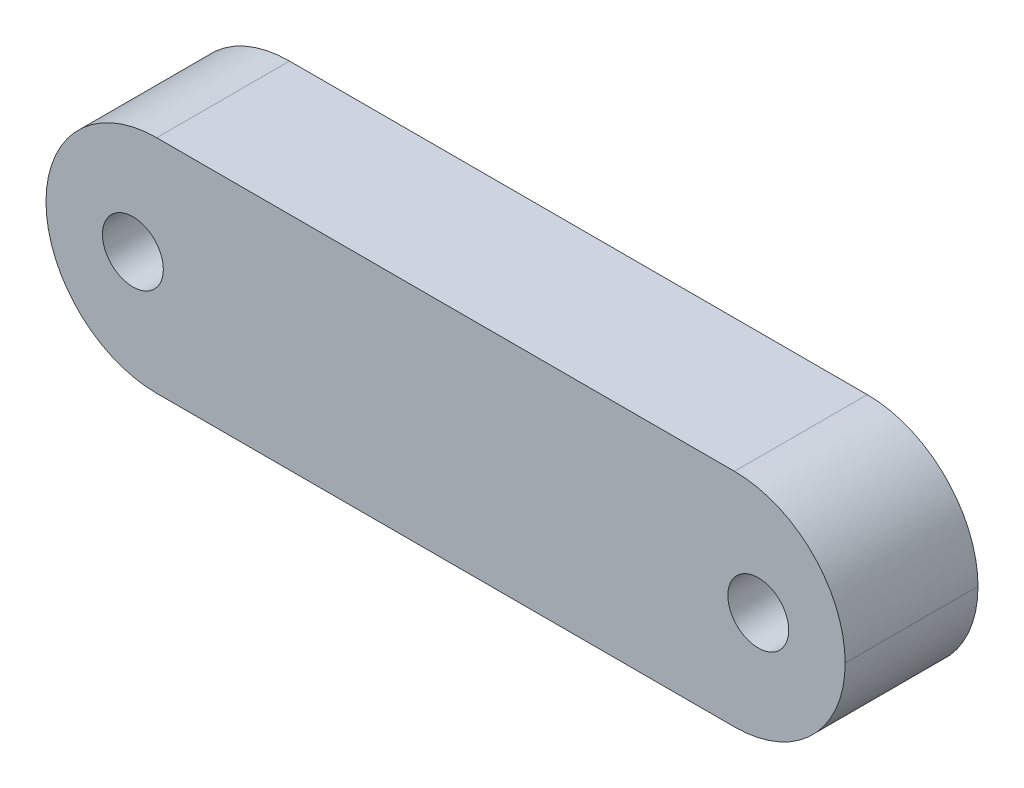
ISO-10303-21;
HEADER;
FILE_DESCRIPTION(('STEP AP214'),'2;1');
FILE_NAME('part.step','',(''),(''),'','','');
FILE_SCHEMA(('AUTOMOTIVE_DESIGN { 1 0 10303 214 1 1 1 1 }'));
ENDSEC;
DATA;
#1=APPLICATION_CONTEXT('core data for automotive mechanical design processes');
#2=APPLICATION_PROTOCOL_DEFINITION('international standard','automotive_design',2000,#1);
#3=PRODUCT_CONTEXT('',#1,'mechanical');
#4=PRODUCT('Part','Part','',(#3));
#5=PRODUCT_RELATED_PRODUCT_CATEGORY('part','',(#4));
#6=PRODUCT_DEFINITION_FORMATION('','',#4);
#7=PRODUCT_DEFINITION_CONTEXT('part definition',#1,'design');
#8=PRODUCT_DEFINITION('design','',#6,#7);
#9=PRODUCT_DEFINITION_SHAPE('','',#8);
#10=(LENGTH_UNIT() NAMED_UNIT(*) SI_UNIT(.MILLI.,.METRE.));
#11=(NAMED_UNIT(*) PLANE_ANGLE_UNIT() SI_UNIT($,.RADIAN.));
#12=(NAMED_UNIT(*) SI_UNIT($,.STERADIAN.) SOLID_ANGLE_UNIT());
#13=UNCERTAINTY_MEASURE_WITH_UNIT(LENGTH_MEASURE(1.E-05),#10,'distance_accuracy_value','');
#14=(GEOMETRIC_REPRESENTATION_CONTEXT(3) GLOBAL_UNCERTAINTY_ASSIGNED_CONTEXT((#13)) GLOBAL_UNIT_ASSIGNED_CONTEXT((#10,
#11,#12)) REPRESENTATION_CONTEXT('',''));
#15=CARTESIAN_POINT('',(0.,0.,0.));
#16=DIRECTION('',(0.,0.,1.));
#17=DIRECTION('',(1.,0.,0.));
#18=AXIS2_PLACEMENT_3D('',#15,#16,#17);
#19=CARTESIAN_POINT('',(0.,0.,12.));
#20=DIRECTION('',(0.,0.,-1.));
#21=DIRECTION('',(-1.,0.,0.));
#22=AXIS2_PLACEMENT_3D('',#19,#20,#21);
#23=PLANE('',#22);
#24=CARTESIAN_POINT('',(26.1,0.,12.));
#25=DIRECTION('',(0.,0.,-1.));
#26=DIRECTION('',(-1.,0.,0.));
#27=AXIS2_PLACEMENT_3D('',#24,#25,#26);
#28=CIRCLE('',#27,10.);
#29=CARTESIAN_POINT('',(26.1,-10.,12.));
#30=VERTEX_POINT('',#29);
#31=CARTESIAN_POINT('',(36.1,0.,12.));
#32=VERTEX_POINT('',#31);
#33=EDGE_CURVE('E157',#30,#32,#28,.F.);
#34=ORIENTED_EDGE('',*,*,#33,.T.);
#35=CARTESIAN_POINT('',(26.1,0.,12.));
#36=DIRECTION('',(0.,0.,-1.));
#37=DIRECTION('',(-1.,0.,0.));
#38=AXIS2_PLACEMENT_3D('',#35,#36,#37);
#39=CIRCLE('',#38,10.);
#40=CARTESIAN_POINT('',(26.1,10.,12.));
#41=VERTEX_POINT('',#40);
#42=EDGE_CURVE('E160',#32,#41,#39,.F.);
#43=ORIENTED_EDGE('',*,*,#42,.T.);
#44=DIRECTION('',(-1.,0.,0.));
#45=VECTOR('',#44,1.);
#46=CARTESIAN_POINT('',(-36.1,10.,12.));
#47=LINE('',#46,#45);
#48=CARTESIAN_POINT('',(-26.1,10.,12.));
#49=VERTEX_POINT('',#48);
#50=EDGE_CURVE('E121',#41,#49,#47,.T.);
#51=ORIENTED_EDGE('',*,*,#50,.T.);
#52=CARTESIAN_POINT('',(-26.1,0.,12.));
#53=DIRECTION('',(0.,0.,-1.));
#54=DIRECTION('',(-1.,0.,0.));
#55=AXIS2_PLACEMENT_3D('',#52,#53,#54);
#56=CIRCLE('',#55,10.);
#57=CARTESIAN_POINT('',(-36.1,0.,12.));
#58=VERTEX_POINT('',#57);
#59=EDGE_CURVE('E154',#49,#58,#56,.F.);
#60=ORIENTED_EDGE('',*,*,#59,.T.);
#61=CARTESIAN_POINT('',(-26.1,0.,12.));
#62=DIRECTION('',(0.,0.,-1.));
#63=DIRECTION('',(-1.,0.,0.));
#64=AXIS2_PLACEMENT_3D('',#61,#62,#63);
#65=CIRCLE('',#64,10.);
#66=CARTESIAN_POINT('',(-26.1,-10.,12.));
#67=VERTEX_POINT('',#66);
#68=EDGE_CURVE('E68',#58,#67,#65,.F.);
#69=ORIENTED_EDGE('',*,*,#68,.T.);
#70=DIRECTION('',(1.,0.,0.));
#71=VECTOR('',#70,1.);
#72=CARTESIAN_POINT('',(-36.1,-10.,12.));
#73=LINE('',#72,#71);
#74=EDGE_CURVE('E141',#67,#30,#73,.T.);
#75=ORIENTED_EDGE('',*,*,#74,.T.);
#76=EDGE_LOOP('',(#34,#43,#51,#60,#69,#75));
#77=FACE_BOUND('',#76,.T.);
#78=CARTESIAN_POINT('',(-28.25,0.,12.));
#79=DIRECTION('',(0.,0.,1.));
#80=DIRECTION('',(1.,0.,0.));
#81=AXIS2_PLACEMENT_3D('',#78,#79,#80);
#82=CIRCLE('',#81,2.75);
#83=CARTESIAN_POINT('',(-25.5,0.,12.));
#84=VERTEX_POINT('',#83);
#85=EDGE_CURVE('E132',#84,#84,#82,.T.);
#86=ORIENTED_EDGE('',*,*,#85,.F.);
#87=EDGE_LOOP('',(#86));
#88=FACE_BOUND('',#87,.T.);
#89=CARTESIAN_POINT('',(28.25,0.,12.));
#90=DIRECTION('',(0.,0.,1.));
#91=DIRECTION('',(1.,0.,0.));
#92=AXIS2_PLACEMENT_3D('',#89,#90,#91);
#93=CIRCLE('',#92,2.75);
#94=CARTESIAN_POINT('',(31.,0.,12.));
#95=VERTEX_POINT('',#94);
#96=EDGE_CURVE('E169',#95,#95,#93,.T.);
#97=ORIENTED_EDGE('',*,*,#96,.F.);
#98=EDGE_LOOP('',(#97));
#99=FACE_BOUND('',#98,.T.);
#100=ADVANCED_FACE('F45',(#77,#88,#99),#23,.F.);
#101=CARTESIAN_POINT('',(0.,0.,0.));
#102=DIRECTION('',(0.,0.,-1.));
#103=DIRECTION('',(-1.,0.,0.));
#104=AXIS2_PLACEMENT_3D('',#101,#102,#103);
#105=PLANE('',#104);
#106=CARTESIAN_POINT('',(-28.25,0.,0.));
#107=DIRECTION('',(0.,0.,1.));
#108=DIRECTION('',(1.,0.,0.));
#109=AXIS2_PLACEMENT_3D('',#106,#107,#108);
#110=CIRCLE('',#109,2.75);
#111=CARTESIAN_POINT('',(-25.5,0.,0.));
#112=VERTEX_POINT('',#111);
#113=EDGE_CURVE('E138',#112,#112,#110,.T.);
#114=ORIENTED_EDGE('',*,*,#113,.T.);
#115=EDGE_LOOP('',(#114));
#116=FACE_BOUND('',#115,.T.);
#117=DIRECTION('',(-1.,0.,0.));
#118=VECTOR('',#117,1.);
#119=CARTESIAN_POINT('',(-36.1,10.,0.));
#120=LINE('',#119,#118);
#121=CARTESIAN_POINT('',(26.1,10.,0.));
#122=VERTEX_POINT('',#121);
#123=CARTESIAN_POINT('',(-26.1,10.,0.));
#124=VERTEX_POINT('',#123);
#125=EDGE_CURVE('E118',#122,#124,#120,.T.);
#126=ORIENTED_EDGE('',*,*,#125,.F.);
#127=CARTESIAN_POINT('',(26.1,0.,0.));
#128=DIRECTION('',(0.,0.,-1.));
#129=DIRECTION('',(-1.,0.,0.));
#130=AXIS2_PLACEMENT_3D('',#127,#128,#129);
#131=CIRCLE('',#130,10.);
#132=CARTESIAN_POINT('',(36.1,0.,0.));
#133=VERTEX_POINT('',#132);
#134=EDGE_CURVE('E100',#122,#133,#131,.T.);
#135=ORIENTED_EDGE('',*,*,#134,.T.);
#136=CARTESIAN_POINT('',(26.1,0.,0.));
#137=DIRECTION('',(0.,0.,-1.));
#138=DIRECTION('',(-1.,0.,0.));
#139=AXIS2_PLACEMENT_3D('',#136,#137,#138);
#140=CIRCLE('',#139,10.);
#141=CARTESIAN_POINT('',(26.1,-10.,0.));
#142=VERTEX_POINT('',#141);
#143=EDGE_CURVE('E111',#133,#142,#140,.T.);
#144=ORIENTED_EDGE('',*,*,#143,.T.);
#145=DIRECTION('',(1.,0.,0.));
#146=VECTOR('',#145,1.);
#147=CARTESIAN_POINT('',(-36.1,-10.,0.));
#148=LINE('',#147,#146);
#149=CARTESIAN_POINT('',(-26.1,-10.,0.));
#150=VERTEX_POINT('',#149);
#151=EDGE_CURVE('E131',#150,#142,#148,.T.);
#152=ORIENTED_EDGE('',*,*,#151,.F.);
#153=CARTESIAN_POINT('',(-26.1,0.,0.));
#154=DIRECTION('',(0.,0.,-1.));
#155=DIRECTION('',(-1.,0.,0.));
#156=AXIS2_PLACEMENT_3D('',#153,#154,#155);
#157=CIRCLE('',#156,10.);
#158=CARTESIAN_POINT('',(-36.1,0.,0.));
#159=VERTEX_POINT('',#158);
#160=EDGE_CURVE('E123',#150,#159,#157,.T.);
#161=ORIENTED_EDGE('',*,*,#160,.T.);
#162=CARTESIAN_POINT('',(-26.1,0.,0.));
#163=DIRECTION('',(0.,0.,-1.));
#164=DIRECTION('',(-1.,0.,0.));
#165=AXIS2_PLACEMENT_3D('',#162,#163,#164);
#166=CIRCLE('',#165,10.);
#167=EDGE_CURVE('E129',#159,#124,#166,.T.);
#168=ORIENTED_EDGE('',*,*,#167,.T.);
#169=EDGE_LOOP('',(#126,#135,#144,#152,#161,#168));
#170=FACE_BOUND('',#169,.T.);
#171=CARTESIAN_POINT('',(28.25,0.,0.));
#172=DIRECTION('',(0.,0.,1.));
#173=DIRECTION('',(1.,0.,0.));
#174=AXIS2_PLACEMENT_3D('',#171,#172,#173);
#175=CIRCLE('',#174,2.75);
#176=CARTESIAN_POINT('',(31.,0.,0.));
#177=VERTEX_POINT('',#176);
#178=EDGE_CURVE('E165',#177,#177,#175,.T.);
#179=ORIENTED_EDGE('',*,*,#178,.T.);
#180=EDGE_LOOP('',(#179));
#181=FACE_BOUND('',#180,.T.);
#182=ADVANCED_FACE('F126',(#116,#170,#181),#105,.T.);
#183=CARTESIAN_POINT('',(-36.1,10.,12.));
#184=DIRECTION('',(0.,-1.,0.));
#185=DIRECTION('',(0.,0.,-1.));
#186=AXIS2_PLACEMENT_3D('',#183,#184,#185);
#187=PLANE('',#186);
#188=ORIENTED_EDGE('',*,*,#50,.F.);
#189=DIRECTION('',(0.,0.,-1.));
#190=VECTOR('',#189,1.);
#191=CARTESIAN_POINT('',(26.1,10.,12.));
#192=LINE('',#191,#190);
#193=EDGE_CURVE('E104',#41,#122,#192,.T.);
#194=ORIENTED_EDGE('',*,*,#193,.T.);
#195=ORIENTED_EDGE('',*,*,#125,.T.);
#196=DIRECTION('',(0.,0.,-1.));
#197=VECTOR('',#196,1.);
#198=CARTESIAN_POINT('',(-26.1,10.,12.));
#199=LINE('',#198,#197);
#200=EDGE_CURVE('E124',#124,#49,#199,.F.);
#201=ORIENTED_EDGE('',*,*,#200,.T.);
#202=EDGE_LOOP('',(#188,#194,#195,#201));
#203=FACE_BOUND('',#202,.T.);
#204=ADVANCED_FACE('F116',(#203),#187,.F.);
#205=CARTESIAN_POINT('',(-36.1,-10.,12.));
#206=DIRECTION('',(0.,1.,0.));
#207=DIRECTION('',(0.,0.,1.));
#208=AXIS2_PLACEMENT_3D('',#205,#206,#207);
#209=PLANE('',#208);
#210=ORIENTED_EDGE('',*,*,#151,.T.);
#211=DIRECTION('',(0.,0.,-1.));
#212=VECTOR('',#211,1.);
#213=CARTESIAN_POINT('',(26.1,-10.,12.));
#214=LINE('',#213,#212);
#215=EDGE_CURVE('E11',#142,#30,#214,.F.);
#216=ORIENTED_EDGE('',*,*,#215,.T.);
#217=ORIENTED_EDGE('',*,*,#74,.F.);
#218=DIRECTION('',(0.,0.,-1.));
#219=VECTOR('',#218,1.);
#220=CARTESIAN_POINT('',(-26.1,-10.,12.));
#221=LINE('',#220,#219);
#222=EDGE_CURVE('E55',#67,#150,#221,.T.);
#223=ORIENTED_EDGE('',*,*,#222,.T.);
#224=EDGE_LOOP('',(#210,#216,#217,#223));
#225=FACE_BOUND('',#224,.T.);
#226=ADVANCED_FACE('F179',(#225),#209,.F.);
#227=CARTESIAN_POINT('',(-28.25,0.,12.));
#228=DIRECTION('',(0.,0.,-1.));
#229=DIRECTION('',(-1.,0.,0.));
#230=AXIS2_PLACEMENT_3D('',#227,#228,#229);
#231=CYLINDRICAL_SURFACE('',#230,2.75);
#232=ORIENTED_EDGE('',*,*,#85,.T.);
#233=EDGE_LOOP('',(#232));
#234=FACE_BOUND('',#233,.T.);
#235=ORIENTED_EDGE('',*,*,#113,.F.);
#236=EDGE_LOOP('',(#235));
#237=FACE_BOUND('',#236,.T.);
#238=ADVANCED_FACE('F205',(#234,#237),#231,.F.);
#239=CARTESIAN_POINT('',(28.25,0.,12.));
#240=DIRECTION('',(0.,0.,-1.));
#241=DIRECTION('',(-1.,0.,0.));
#242=AXIS2_PLACEMENT_3D('',#239,#240,#241);
#243=CYLINDRICAL_SURFACE('',#242,2.75);
#244=ORIENTED_EDGE('',*,*,#96,.T.);
#245=EDGE_LOOP('',(#244));
#246=FACE_BOUND('',#245,.T.);
#247=ORIENTED_EDGE('',*,*,#178,.F.);
#248=EDGE_LOOP('',(#247));
#249=FACE_BOUND('',#248,.T.);
#250=ADVANCED_FACE('F194',(#246,#249),#243,.F.);
#251=CARTESIAN_POINT('',(26.1,0.,12.));
#252=DIRECTION('',(0.,0.,-1.));
#253=DIRECTION('',(-1.,0.,0.));
#254=AXIS2_PLACEMENT_3D('',#251,#252,#253);
#255=CYLINDRICAL_SURFACE('',#254,10.);
#256=DIRECTION('',(0.,0.,-1.));
#257=VECTOR('',#256,1.);
#258=CARTESIAN_POINT('',(36.1,0.,12.));
#259=LINE('',#258,#257);
#260=EDGE_CURVE('E106',#32,#133,#259,.T.);
#261=ORIENTED_EDGE('',*,*,#260,.F.);
#262=ORIENTED_EDGE('',*,*,#33,.F.);
#263=ORIENTED_EDGE('',*,*,#215,.F.);
#264=ORIENTED_EDGE('',*,*,#143,.F.);
#265=EDGE_LOOP('',(#261,#262,#263,#264));
#266=FACE_BOUND('',#265,.T.);
#267=ADVANCED_FACE('F181',(#266),#255,.T.);
#268=CARTESIAN_POINT('',(26.1,0.,12.));
#269=DIRECTION('',(0.,0.,-1.));
#270=DIRECTION('',(-1.,0.,0.));
#271=AXIS2_PLACEMENT_3D('',#268,#269,#270);
#272=CYLINDRICAL_SURFACE('',#271,10.);
#273=ORIENTED_EDGE('',*,*,#42,.F.);
#274=ORIENTED_EDGE('',*,*,#260,.T.);
#275=ORIENTED_EDGE('',*,*,#134,.F.);
#276=ORIENTED_EDGE('',*,*,#193,.F.);
#277=EDGE_LOOP('',(#273,#274,#275,#276));
#278=FACE_BOUND('',#277,.T.);
#279=ADVANCED_FACE('F103',(#278),#272,.T.);
#280=CARTESIAN_POINT('',(-26.1,0.,12.));
#281=DIRECTION('',(0.,0.,-1.));
#282=DIRECTION('',(-1.,0.,0.));
#283=AXIS2_PLACEMENT_3D('',#280,#281,#282);
#284=CYLINDRICAL_SURFACE('',#283,10.);
#285=ORIENTED_EDGE('',*,*,#222,.F.);
#286=ORIENTED_EDGE('',*,*,#68,.F.);
#287=DIRECTION('',(0.,0.,-1.));
#288=VECTOR('',#287,1.);
#289=CARTESIAN_POINT('',(-36.1,0.,12.));
#290=LINE('',#289,#288);
#291=EDGE_CURVE('E49',#159,#58,#290,.F.);
#292=ORIENTED_EDGE('',*,*,#291,.F.);
#293=ORIENTED_EDGE('',*,*,#160,.F.);
#294=EDGE_LOOP('',(#285,#286,#292,#293));
#295=FACE_BOUND('',#294,.T.);
#296=ADVANCED_FACE('F47',(#295),#284,.T.);
#297=CARTESIAN_POINT('',(-26.1,0.,12.));
#298=DIRECTION('',(0.,0.,-1.));
#299=DIRECTION('',(-1.,0.,0.));
#300=AXIS2_PLACEMENT_3D('',#297,#298,#299);
#301=CYLINDRICAL_SURFACE('',#300,10.);
#302=ORIENTED_EDGE('',*,*,#59,.F.);
#303=ORIENTED_EDGE('',*,*,#200,.F.);
#304=ORIENTED_EDGE('',*,*,#167,.F.);
#305=ORIENTED_EDGE('',*,*,#291,.T.);
#306=EDGE_LOOP('',(#302,#303,#304,#305));
#307=FACE_BOUND('',#306,.T.);
#308=ADVANCED_FACE('F174',(#307),#301,.T.);
#309=CLOSED_SHELL('',(#100,#182,#204,#226,#238,#250,#267,#279,#296,#308));
#310=MANIFOLD_SOLID_BREP('B2',#309);
#311=ADVANCED_BREP_SHAPE_REPRESENTATION('',(#18,#310),#14);
#312=SHAPE_DEFINITION_REPRESENTATION(#9,#311);
ENDSEC;
END-ISO-10303-21;
